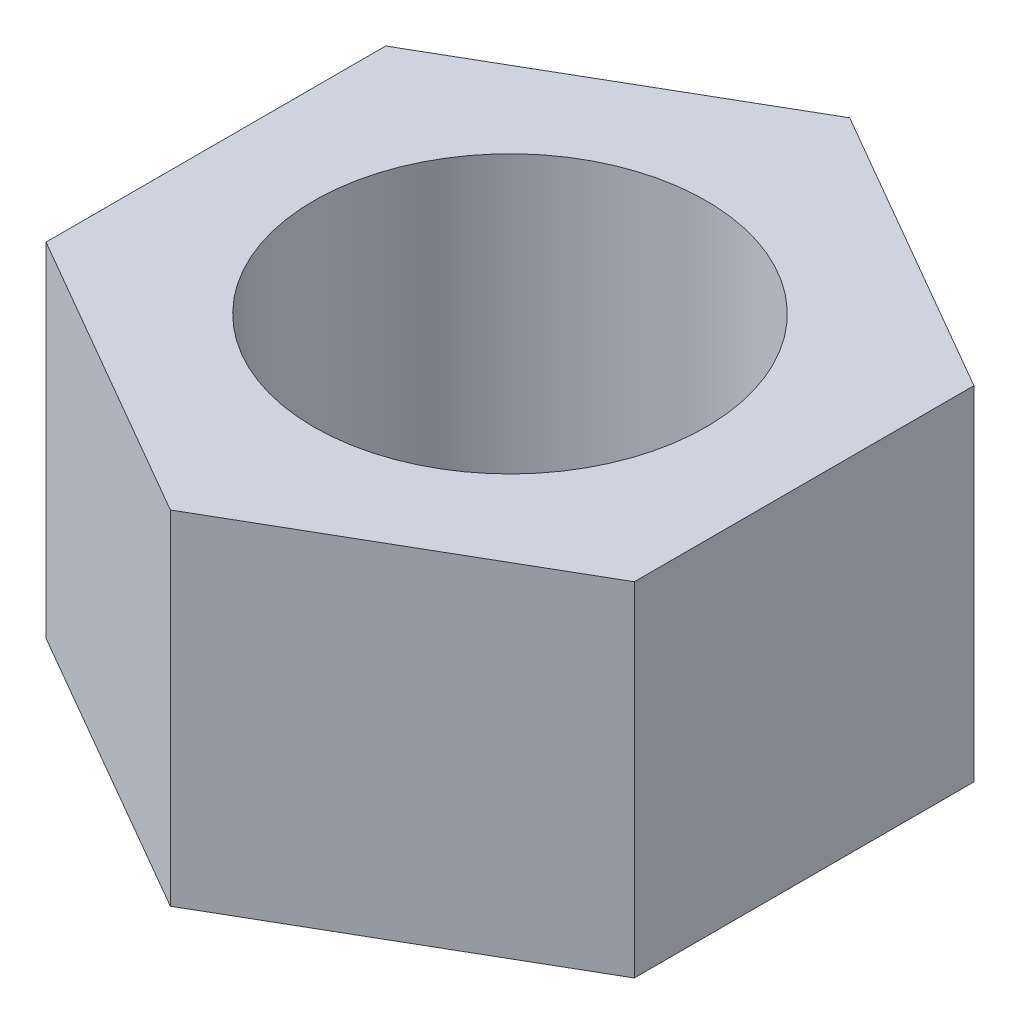
ISO-10303-21;
HEADER;
FILE_DESCRIPTION(('STEP AP214'),'2;1');
FILE_NAME('part.step','',(''),(''),'','','');
FILE_SCHEMA(('AUTOMOTIVE_DESIGN { 1 0 10303 214 1 1 1 1 }'));
ENDSEC;
DATA;
#1=APPLICATION_CONTEXT('core data for automotive mechanical design processes');
#2=APPLICATION_PROTOCOL_DEFINITION('international standard','automotive_design',2000,#1);
#3=PRODUCT_CONTEXT('',#1,'mechanical');
#4=PRODUCT('Part','Part','',(#3));
#5=PRODUCT_RELATED_PRODUCT_CATEGORY('part','',(#4));
#6=PRODUCT_DEFINITION_FORMATION('','',#4);
#7=PRODUCT_DEFINITION_CONTEXT('part definition',#1,'design');
#8=PRODUCT_DEFINITION('design','',#6,#7);
#9=PRODUCT_DEFINITION_SHAPE('','',#8);
#10=(LENGTH_UNIT() NAMED_UNIT(*) SI_UNIT(.MILLI.,.METRE.));
#11=(NAMED_UNIT(*) PLANE_ANGLE_UNIT() SI_UNIT($,.RADIAN.));
#12=(NAMED_UNIT(*) SI_UNIT($,.STERADIAN.) SOLID_ANGLE_UNIT());
#13=UNCERTAINTY_MEASURE_WITH_UNIT(LENGTH_MEASURE(1.E-05),#10,'distance_accuracy_value','');
#14=(GEOMETRIC_REPRESENTATION_CONTEXT(3) GLOBAL_UNCERTAINTY_ASSIGNED_CONTEXT((#13)) GLOBAL_UNIT_ASSIGNED_CONTEXT((#10,
#11,#12)) REPRESENTATION_CONTEXT('',''));
#15=CARTESIAN_POINT('',(0.,0.,0.));
#16=DIRECTION('',(0.,0.,1.));
#17=DIRECTION('',(1.,0.,0.));
#18=AXIS2_PLACEMENT_3D('',#15,#16,#17);
#19=CARTESIAN_POINT('',(0.,4.1671875,0.));
#20=DIRECTION('',(0.,1.,0.));
#21=DIRECTION('',(0.,0.,1.));
#22=AXIS2_PLACEMENT_3D('',#19,#20,#21);
#23=PLANE('',#22);
#24=DIRECTION('',(-0.866025403784439,0.,-0.5));
#25=VECTOR('',#24,1.);
#26=CARTESIAN_POINT('',(7.14375,4.1671875,-4.12444598552339));
#27=LINE('',#26,#25);
#28=CARTESIAN_POINT('',(7.14375,4.1671875,-4.12444598552339));
#29=VERTEX_POINT('',#28);
#30=CARTESIAN_POINT('',(0.,4.1671875,-8.24889197104678));
#31=VERTEX_POINT('',#30);
#32=EDGE_CURVE('E134',#29,#31,#27,.T.);
#33=ORIENTED_EDGE('',*,*,#32,.T.);
#34=DIRECTION('',(-0.866025403784439,0.,0.499999999999999));
#35=VECTOR('',#34,1.);
#36=CARTESIAN_POINT('',(0.,4.1671875,-8.24889197104678));
#37=LINE('',#36,#35);
#38=CARTESIAN_POINT('',(-7.14375,4.1671875,-4.12444598552339));
#39=VERTEX_POINT('',#38);
#40=EDGE_CURVE('E101',#31,#39,#37,.T.);
#41=ORIENTED_EDGE('',*,*,#40,.T.);
#42=DIRECTION('',(0.,0.,1.));
#43=VECTOR('',#42,1.);
#44=CARTESIAN_POINT('',(-7.14375,4.1671875,-4.12444598552339));
#45=LINE('',#44,#43);
#46=CARTESIAN_POINT('',(-7.14375,4.1671875,4.12444598552339));
#47=VERTEX_POINT('',#46);
#48=EDGE_CURVE('E137',#39,#47,#45,.T.);
#49=ORIENTED_EDGE('',*,*,#48,.T.);
#50=DIRECTION('',(0.866025403784439,0.,0.499999999999999));
#51=VECTOR('',#50,1.);
#52=CARTESIAN_POINT('',(-7.14375,4.1671875,4.12444598552339));
#53=LINE('',#52,#51);
#54=CARTESIAN_POINT('',(0.,4.1671875,8.24889197104678));
#55=VERTEX_POINT('',#54);
#56=EDGE_CURVE('E139',#47,#55,#53,.T.);
#57=ORIENTED_EDGE('',*,*,#56,.T.);
#58=DIRECTION('',(0.866025403784439,0.,-0.5));
#59=VECTOR('',#58,1.);
#60=CARTESIAN_POINT('',(0.,4.1671875,8.24889197104678));
#61=LINE('',#60,#59);
#62=CARTESIAN_POINT('',(7.14375,4.1671875,4.12444598552339));
#63=VERTEX_POINT('',#62);
#64=EDGE_CURVE('E65',#55,#63,#61,.T.);
#65=ORIENTED_EDGE('',*,*,#64,.T.);
#66=DIRECTION('',(0.,0.,-1.));
#67=VECTOR('',#66,1.);
#68=CARTESIAN_POINT('',(7.14375,4.1671875,4.12444598552339));
#69=LINE('',#68,#67);
#70=EDGE_CURVE('E60',#63,#29,#69,.T.);
#71=ORIENTED_EDGE('',*,*,#70,.T.);
#72=EDGE_LOOP('',(#33,#41,#49,#57,#65,#71));
#73=FACE_BOUND('',#72,.T.);
#74=CARTESIAN_POINT('',(0.,4.1671875,0.));
#75=DIRECTION('',(0.,1.,0.));
#76=DIRECTION('',(0.,0.,1.));
#77=AXIS2_PLACEMENT_3D('',#74,#75,#76);
#78=CIRCLE('',#77,4.7625);
#79=CARTESIAN_POINT('',(0.,4.1671875,4.7625));
#80=VERTEX_POINT('',#79);
#81=EDGE_CURVE('E131',#80,#80,#78,.T.);
#82=ORIENTED_EDGE('',*,*,#81,.F.);
#83=EDGE_LOOP('',(#82));
#84=FACE_BOUND('',#83,.T.);
#85=ADVANCED_FACE('F45',(#73,#84),#23,.T.);
#86=CARTESIAN_POINT('',(7.14375,4.1671875,-4.12444598552339));
#87=DIRECTION('',(-0.5,0.,0.866025403784439));
#88=DIRECTION('',(0.866025403784439,0.,0.5));
#89=AXIS2_PLACEMENT_3D('',#86,#87,#88);
#90=PLANE('',#89);
#91=DIRECTION('',(0.,-1.,0.));
#92=VECTOR('',#91,1.);
#93=CARTESIAN_POINT('',(7.14375,4.1671875,-4.12444598552339));
#94=LINE('',#93,#92);
#95=CARTESIAN_POINT('',(7.14375,-4.1671875,-4.12444598552339));
#96=VERTEX_POINT('',#95);
#97=EDGE_CURVE('E116',#29,#96,#94,.T.);
#98=ORIENTED_EDGE('',*,*,#97,.T.);
#99=DIRECTION('',(-0.866025403784439,0.,-0.5));
#100=VECTOR('',#99,1.);
#101=CARTESIAN_POINT('',(7.14375,-4.1671875,-4.12444598552339));
#102=LINE('',#101,#100);
#103=CARTESIAN_POINT('',(0.,-4.1671875,-8.24889197104678));
#104=VERTEX_POINT('',#103);
#105=EDGE_CURVE('E110',#96,#104,#102,.T.);
#106=ORIENTED_EDGE('',*,*,#105,.T.);
#107=DIRECTION('',(0.,-1.,0.));
#108=VECTOR('',#107,1.);
#109=CARTESIAN_POINT('',(0.,4.1671875,-8.24889197104678));
#110=LINE('',#109,#108);
#111=EDGE_CURVE('E11',#31,#104,#110,.T.);
#112=ORIENTED_EDGE('',*,*,#111,.F.);
#113=ORIENTED_EDGE('',*,*,#32,.F.);
#114=EDGE_LOOP('',(#98,#106,#112,#113));
#115=FACE_BOUND('',#114,.T.);
#116=ADVANCED_FACE('F47',(#115),#90,.F.);
#117=CARTESIAN_POINT('',(0.,4.1671875,-8.24889197104678));
#118=DIRECTION('',(0.499999999999999,0.,0.866025403784439));
#119=DIRECTION('',(0.866025403784439,0.,-0.499999999999999));
#120=AXIS2_PLACEMENT_3D('',#117,#118,#119);
#121=PLANE('',#120);
#122=ORIENTED_EDGE('',*,*,#111,.T.);
#123=DIRECTION('',(-0.866025403784439,0.,0.499999999999999));
#124=VECTOR('',#123,1.);
#125=CARTESIAN_POINT('',(0.,-4.1671875,-8.24889197104678));
#126=LINE('',#125,#124);
#127=CARTESIAN_POINT('',(-7.14375,-4.1671875,-4.12444598552339));
#128=VERTEX_POINT('',#127);
#129=EDGE_CURVE('E100',#104,#128,#126,.T.);
#130=ORIENTED_EDGE('',*,*,#129,.T.);
#131=DIRECTION('',(0.,-1.,0.));
#132=VECTOR('',#131,1.);
#133=CARTESIAN_POINT('',(-7.14375,4.1671875,-4.12444598552339));
#134=LINE('',#133,#132);
#135=EDGE_CURVE('E53',#39,#128,#134,.T.);
#136=ORIENTED_EDGE('',*,*,#135,.F.);
#137=ORIENTED_EDGE('',*,*,#40,.F.);
#138=EDGE_LOOP('',(#122,#130,#136,#137));
#139=FACE_BOUND('',#138,.T.);
#140=ADVANCED_FACE('F98',(#139),#121,.F.);
#141=CARTESIAN_POINT('',(-7.14375,4.1671875,-4.12444598552339));
#142=DIRECTION('',(1.,0.,0.));
#143=DIRECTION('',(0.,0.,-1.));
#144=AXIS2_PLACEMENT_3D('',#141,#142,#143);
#145=PLANE('',#144);
#146=ORIENTED_EDGE('',*,*,#135,.T.);
#147=DIRECTION('',(0.,0.,1.));
#148=VECTOR('',#147,1.);
#149=CARTESIAN_POINT('',(-7.14375,-4.1671875,-4.12444598552339));
#150=LINE('',#149,#148);
#151=CARTESIAN_POINT('',(-7.14375,-4.1671875,4.12444598552339));
#152=VERTEX_POINT('',#151);
#153=EDGE_CURVE('E114',#128,#152,#150,.T.);
#154=ORIENTED_EDGE('',*,*,#153,.T.);
#155=DIRECTION('',(0.,-1.,0.));
#156=VECTOR('',#155,1.);
#157=CARTESIAN_POINT('',(-7.14375,4.1671875,4.12444598552339));
#158=LINE('',#157,#156);
#159=EDGE_CURVE('E148',#47,#152,#158,.T.);
#160=ORIENTED_EDGE('',*,*,#159,.F.);
#161=ORIENTED_EDGE('',*,*,#48,.F.);
#162=EDGE_LOOP('',(#146,#154,#160,#161));
#163=FACE_BOUND('',#162,.T.);
#164=ADVANCED_FACE('F151',(#163),#145,.F.);
#165=CARTESIAN_POINT('',(-7.14375,4.1671875,4.12444598552339));
#166=DIRECTION('',(0.499999999999999,0.,-0.866025403784439));
#167=DIRECTION('',(-0.866025403784439,0.,-0.499999999999999));
#168=AXIS2_PLACEMENT_3D('',#165,#166,#167);
#169=PLANE('',#168);
#170=ORIENTED_EDGE('',*,*,#159,.T.);
#171=DIRECTION('',(0.866025403784439,0.,0.499999999999999));
#172=VECTOR('',#171,1.);
#173=CARTESIAN_POINT('',(-7.14375,-4.1671875,4.12444598552339));
#174=LINE('',#173,#172);
#175=CARTESIAN_POINT('',(0.,-4.1671875,8.24889197104678));
#176=VERTEX_POINT('',#175);
#177=EDGE_CURVE('E123',#152,#176,#174,.T.);
#178=ORIENTED_EDGE('',*,*,#177,.T.);
#179=DIRECTION('',(0.,-1.,0.));
#180=VECTOR('',#179,1.);
#181=CARTESIAN_POINT('',(0.,4.1671875,8.24889197104678));
#182=LINE('',#181,#180);
#183=EDGE_CURVE('E146',#55,#176,#182,.T.);
#184=ORIENTED_EDGE('',*,*,#183,.F.);
#185=ORIENTED_EDGE('',*,*,#56,.F.);
#186=EDGE_LOOP('',(#170,#178,#184,#185));
#187=FACE_BOUND('',#186,.T.);
#188=ADVANCED_FACE('F157',(#187),#169,.F.);
#189=CARTESIAN_POINT('',(0.,4.1671875,8.24889197104678));
#190=DIRECTION('',(-0.5,0.,-0.866025403784439));
#191=DIRECTION('',(-0.866025403784439,0.,0.5));
#192=AXIS2_PLACEMENT_3D('',#189,#190,#191);
#193=PLANE('',#192);
#194=ORIENTED_EDGE('',*,*,#183,.T.);
#195=DIRECTION('',(0.866025403784439,0.,-0.5));
#196=VECTOR('',#195,1.);
#197=CARTESIAN_POINT('',(0.,-4.1671875,8.24889197104678));
#198=LINE('',#197,#196);
#199=CARTESIAN_POINT('',(7.14375,-4.1671875,4.12444598552339));
#200=VERTEX_POINT('',#199);
#201=EDGE_CURVE('E126',#176,#200,#198,.T.);
#202=ORIENTED_EDGE('',*,*,#201,.T.);
#203=DIRECTION('',(0.,-1.,0.));
#204=VECTOR('',#203,1.);
#205=CARTESIAN_POINT('',(7.14375,4.1671875,4.12444598552339));
#206=LINE('',#205,#204);
#207=EDGE_CURVE('E144',#63,#200,#206,.T.);
#208=ORIENTED_EDGE('',*,*,#207,.F.);
#209=ORIENTED_EDGE('',*,*,#64,.F.);
#210=EDGE_LOOP('',(#194,#202,#208,#209));
#211=FACE_BOUND('',#210,.T.);
#212=ADVANCED_FACE('F160',(#211),#193,.F.);
#213=CARTESIAN_POINT('',(7.14375,4.1671875,4.12444598552339));
#214=DIRECTION('',(-1.,0.,0.));
#215=DIRECTION('',(0.,0.,1.));
#216=AXIS2_PLACEMENT_3D('',#213,#214,#215);
#217=PLANE('',#216);
#218=ORIENTED_EDGE('',*,*,#207,.T.);
#219=DIRECTION('',(0.,0.,-1.));
#220=VECTOR('',#219,1.);
#221=CARTESIAN_POINT('',(7.14375,-4.1671875,4.12444598552339));
#222=LINE('',#221,#220);
#223=EDGE_CURVE('E129',#200,#96,#222,.T.);
#224=ORIENTED_EDGE('',*,*,#223,.T.);
#225=ORIENTED_EDGE('',*,*,#97,.F.);
#226=ORIENTED_EDGE('',*,*,#70,.F.);
#227=EDGE_LOOP('',(#218,#224,#225,#226));
#228=FACE_BOUND('',#227,.T.);
#229=ADVANCED_FACE('F162',(#228),#217,.F.);
#230=CARTESIAN_POINT('',(0.,4.1671875,0.));
#231=DIRECTION('',(0.,-1.,0.));
#232=DIRECTION('',(0.,0.,-1.));
#233=AXIS2_PLACEMENT_3D('',#230,#231,#232);
#234=CYLINDRICAL_SURFACE('',#233,4.7625);
#235=ORIENTED_EDGE('',*,*,#81,.T.);
#236=EDGE_LOOP('',(#235));
#237=FACE_BOUND('',#236,.T.);
#238=CARTESIAN_POINT('',(0.,-4.1671875,0.));
#239=DIRECTION('',(0.,1.,0.));
#240=DIRECTION('',(0.,0.,1.));
#241=AXIS2_PLACEMENT_3D('',#238,#239,#240);
#242=CIRCLE('',#241,4.7625);
#243=CARTESIAN_POINT('',(0.,-4.1671875,4.7625));
#244=VERTEX_POINT('',#243);
#245=EDGE_CURVE('E117',#244,#244,#242,.T.);
#246=ORIENTED_EDGE('',*,*,#245,.F.);
#247=EDGE_LOOP('',(#246));
#248=FACE_BOUND('',#247,.T.);
#249=ADVANCED_FACE('F164',(#237,#248),#234,.F.);
#250=CARTESIAN_POINT('',(0.,-4.1671875,0.));
#251=DIRECTION('',(0.,1.,0.));
#252=DIRECTION('',(0.,0.,1.));
#253=AXIS2_PLACEMENT_3D('',#250,#251,#252);
#254=PLANE('',#253);
#255=ORIENTED_EDGE('',*,*,#245,.T.);
#256=EDGE_LOOP('',(#255));
#257=FACE_BOUND('',#256,.T.);
#258=ORIENTED_EDGE('',*,*,#105,.F.);
#259=ORIENTED_EDGE('',*,*,#223,.F.);
#260=ORIENTED_EDGE('',*,*,#201,.F.);
#261=ORIENTED_EDGE('',*,*,#177,.F.);
#262=ORIENTED_EDGE('',*,*,#153,.F.);
#263=ORIENTED_EDGE('',*,*,#129,.F.);
#264=EDGE_LOOP('',(#258,#259,#260,#261,#262,#263));
#265=FACE_BOUND('',#264,.T.);
#266=ADVANCED_FACE('F108',(#257,#265),#254,.F.);
#267=CLOSED_SHELL('',(#85,#116,#140,#164,#188,#212,#229,#249,#266));
#268=MANIFOLD_SOLID_BREP('B2',#267);
#269=ADVANCED_BREP_SHAPE_REPRESENTATION('',(#18,#268),#14);
#270=SHAPE_DEFINITION_REPRESENTATION(#9,#269);
ENDSEC;
END-ISO-10303-21;
